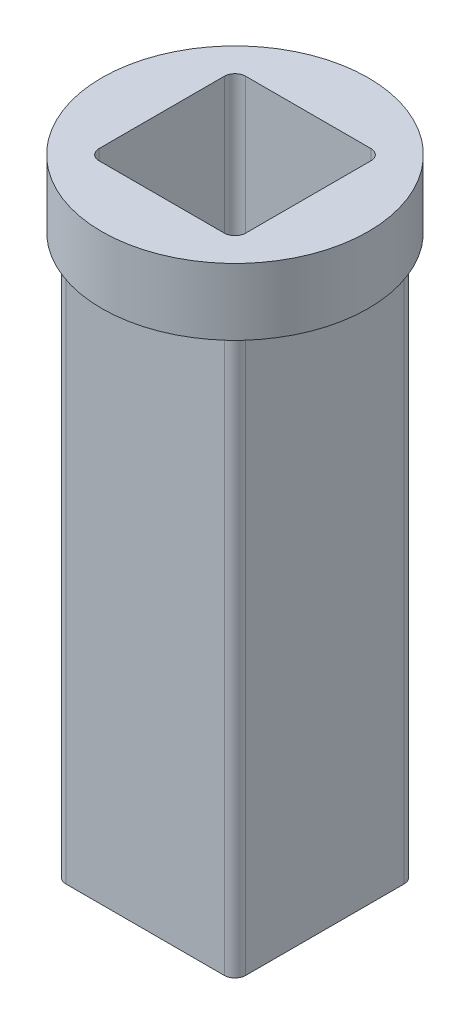
ISO-10303-21;
HEADER;
FILE_DESCRIPTION(('STEP AP214'),'2;1');
FILE_NAME('part.step','',(''),(''),'','','');
FILE_SCHEMA(('AUTOMOTIVE_DESIGN { 1 0 10303 214 1 1 1 1 }'));
ENDSEC;
DATA;
#1=APPLICATION_CONTEXT('core data for automotive mechanical design processes');
#2=APPLICATION_PROTOCOL_DEFINITION('international standard','automotive_design',2000,#1);
#3=PRODUCT_CONTEXT('',#1,'mechanical');
#4=PRODUCT('Part','Part','',(#3));
#5=PRODUCT_RELATED_PRODUCT_CATEGORY('part','',(#4));
#6=PRODUCT_DEFINITION_FORMATION('','',#4);
#7=PRODUCT_DEFINITION_CONTEXT('part definition',#1,'design');
#8=PRODUCT_DEFINITION('design','',#6,#7);
#9=PRODUCT_DEFINITION_SHAPE('','',#8);
#10=(LENGTH_UNIT() NAMED_UNIT(*) SI_UNIT(.MILLI.,.METRE.));
#11=(NAMED_UNIT(*) PLANE_ANGLE_UNIT() SI_UNIT($,.RADIAN.));
#12=(NAMED_UNIT(*) SI_UNIT($,.STERADIAN.) SOLID_ANGLE_UNIT());
#13=UNCERTAINTY_MEASURE_WITH_UNIT(LENGTH_MEASURE(1.E-05),#10,'distance_accuracy_value','');
#14=(GEOMETRIC_REPRESENTATION_CONTEXT(3) GLOBAL_UNCERTAINTY_ASSIGNED_CONTEXT((#13)) GLOBAL_UNIT_ASSIGNED_CONTEXT((#10,
#11,#12)) REPRESENTATION_CONTEXT('',''));
#15=CARTESIAN_POINT('',(0.,0.,0.));
#16=DIRECTION('',(0.,0.,1.));
#17=DIRECTION('',(1.,0.,0.));
#18=AXIS2_PLACEMENT_3D('',#15,#16,#17);
#19=CARTESIAN_POINT('',(-21.43125,133.35,-21.43125));
#20=DIRECTION('',(1.,0.,0.));
#21=DIRECTION('',(0.,0.,-1.));
#22=AXIS2_PLACEMENT_3D('',#19,#20,#21);
#23=PLANE('',#22);
#24=DIRECTION('',(0.,0.,1.));
#25=VECTOR('',#24,1.);
#26=CARTESIAN_POINT('',(-21.43125,0.,-21.43125));
#27=LINE('',#26,#25);
#28=CARTESIAN_POINT('',(-21.43125,0.,-18.89125));
#29=VERTEX_POINT('',#28);
#30=CARTESIAN_POINT('',(-21.43125,0.,18.89125));
#31=VERTEX_POINT('',#30);
#32=EDGE_CURVE('E202',#29,#31,#27,.T.);
#33=ORIENTED_EDGE('',*,*,#32,.T.);
#34=DIRECTION('',(0.,-1.,0.));
#35=VECTOR('',#34,1.);
#36=CARTESIAN_POINT('',(-21.43125,133.35,18.89125));
#37=LINE('',#36,#35);
#38=CARTESIAN_POINT('',(-21.43125,133.35,18.89125));
#39=VERTEX_POINT('',#38);
#40=EDGE_CURVE('E268',#31,#39,#37,.F.);
#41=ORIENTED_EDGE('',*,*,#40,.T.);
#42=DIRECTION('',(0.,0.,1.));
#43=VECTOR('',#42,1.);
#44=CARTESIAN_POINT('',(-21.43125,133.35,-21.43125));
#45=LINE('',#44,#43);
#46=CARTESIAN_POINT('',(-21.43125,133.35,-18.89125));
#47=VERTEX_POINT('',#46);
#48=EDGE_CURVE('E205',#47,#39,#45,.T.);
#49=ORIENTED_EDGE('',*,*,#48,.F.);
#50=DIRECTION('',(0.,-1.,0.));
#51=VECTOR('',#50,1.);
#52=CARTESIAN_POINT('',(-21.43125,133.35,-18.89125));
#53=LINE('',#52,#51);
#54=EDGE_CURVE('E265',#47,#29,#53,.T.);
#55=ORIENTED_EDGE('',*,*,#54,.T.);
#56=EDGE_LOOP('',(#33,#41,#49,#55));
#57=FACE_BOUND('',#56,.T.);
#58=ADVANCED_FACE('F39',(#57),#23,.F.);
#59=CARTESIAN_POINT('',(21.43125,133.35,21.43125));
#60=DIRECTION('',(0.,0.,-1.));
#61=DIRECTION('',(-1.,0.,0.));
#62=AXIS2_PLACEMENT_3D('',#59,#60,#61);
#63=PLANE('',#62);
#64=DIRECTION('',(1.,0.,0.));
#65=VECTOR('',#64,1.);
#66=CARTESIAN_POINT('',(21.43125,0.,21.43125));
#67=LINE('',#66,#65);
#68=CARTESIAN_POINT('',(-18.89125,0.,21.43125));
#69=VERTEX_POINT('',#68);
#70=CARTESIAN_POINT('',(18.89125,0.,21.43125));
#71=VERTEX_POINT('',#70);
#72=EDGE_CURVE('E218',#69,#71,#67,.T.);
#73=ORIENTED_EDGE('',*,*,#72,.T.);
#74=DIRECTION('',(0.,-1.,0.));
#75=VECTOR('',#74,1.);
#76=CARTESIAN_POINT('',(18.89125,133.35,21.43125));
#77=LINE('',#76,#75);
#78=CARTESIAN_POINT('',(18.89125,133.35,21.43125));
#79=VERTEX_POINT('',#78);
#80=EDGE_CURVE('E263',#71,#79,#77,.F.);
#81=ORIENTED_EDGE('',*,*,#80,.T.);
#82=DIRECTION('',(1.,0.,0.));
#83=VECTOR('',#82,1.);
#84=CARTESIAN_POINT('',(21.43125,133.35,21.43125));
#85=LINE('',#84,#83);
#86=CARTESIAN_POINT('',(-18.89125,133.35,21.43125));
#87=VERTEX_POINT('',#86);
#88=EDGE_CURVE('E208',#87,#79,#85,.T.);
#89=ORIENTED_EDGE('',*,*,#88,.F.);
#90=DIRECTION('',(0.,-1.,0.));
#91=VECTOR('',#90,1.);
#92=CARTESIAN_POINT('',(-18.89125,133.35,21.43125));
#93=LINE('',#92,#91);
#94=EDGE_CURVE('E260',#87,#69,#93,.T.);
#95=ORIENTED_EDGE('',*,*,#94,.T.);
#96=EDGE_LOOP('',(#73,#81,#89,#95));
#97=FACE_BOUND('',#96,.T.);
#98=ADVANCED_FACE('F289',(#97),#63,.F.);
#99=CARTESIAN_POINT('',(21.43125,133.35,-21.43125));
#100=DIRECTION('',(-1.,0.,0.));
#101=DIRECTION('',(0.,0.,1.));
#102=AXIS2_PLACEMENT_3D('',#99,#100,#101);
#103=PLANE('',#102);
#104=DIRECTION('',(0.,0.,-1.));
#105=VECTOR('',#104,1.);
#106=CARTESIAN_POINT('',(21.43125,133.35,-21.43125));
#107=LINE('',#106,#105);
#108=CARTESIAN_POINT('',(21.43125,133.35,18.89125));
#109=VERTEX_POINT('',#108);
#110=CARTESIAN_POINT('',(21.43125,133.35,-18.89125));
#111=VERTEX_POINT('',#110);
#112=EDGE_CURVE('E212',#109,#111,#107,.T.);
#113=ORIENTED_EDGE('',*,*,#112,.F.);
#114=DIRECTION('',(0.,-1.,0.));
#115=VECTOR('',#114,1.);
#116=CARTESIAN_POINT('',(21.43125,133.35,18.89125));
#117=LINE('',#116,#115);
#118=CARTESIAN_POINT('',(21.43125,0.,18.89125));
#119=VERTEX_POINT('',#118);
#120=EDGE_CURVE('E249',#109,#119,#117,.T.);
#121=ORIENTED_EDGE('',*,*,#120,.T.);
#122=DIRECTION('',(0.,0.,-1.));
#123=VECTOR('',#122,1.);
#124=CARTESIAN_POINT('',(21.43125,0.,-21.43125));
#125=LINE('',#124,#123);
#126=CARTESIAN_POINT('',(21.43125,0.,-18.89125));
#127=VERTEX_POINT('',#126);
#128=EDGE_CURVE('E221',#119,#127,#125,.T.);
#129=ORIENTED_EDGE('',*,*,#128,.T.);
#130=DIRECTION('',(0.,-1.,0.));
#131=VECTOR('',#130,1.);
#132=CARTESIAN_POINT('',(21.43125,133.35,-18.89125));
#133=LINE('',#132,#131);
#134=EDGE_CURVE('E247',#127,#111,#133,.F.);
#135=ORIENTED_EDGE('',*,*,#134,.T.);
#136=EDGE_LOOP('',(#113,#121,#129,#135));
#137=FACE_BOUND('',#136,.T.);
#138=ADVANCED_FACE('F309',(#137),#103,.F.);
#139=CARTESIAN_POINT('',(21.43125,133.35,-21.43125));
#140=DIRECTION('',(0.,0.,1.));
#141=DIRECTION('',(1.,0.,0.));
#142=AXIS2_PLACEMENT_3D('',#139,#140,#141);
#143=PLANE('',#142);
#144=DIRECTION('',(-1.,0.,0.));
#145=VECTOR('',#144,1.);
#146=CARTESIAN_POINT('',(21.43125,133.35,-21.43125));
#147=LINE('',#146,#145);
#148=CARTESIAN_POINT('',(18.89125,133.35,-21.43125));
#149=VERTEX_POINT('',#148);
#150=CARTESIAN_POINT('',(-18.89125,133.35,-21.43125));
#151=VERTEX_POINT('',#150);
#152=EDGE_CURVE('E214',#149,#151,#147,.T.);
#153=ORIENTED_EDGE('',*,*,#152,.F.);
#154=DIRECTION('',(0.,-1.,0.));
#155=VECTOR('',#154,1.);
#156=CARTESIAN_POINT('',(18.89125,133.35,-21.43125));
#157=LINE('',#156,#155);
#158=CARTESIAN_POINT('',(18.89125,0.,-21.43125));
#159=VERTEX_POINT('',#158);
#160=EDGE_CURVE('E163',#149,#159,#157,.T.);
#161=ORIENTED_EDGE('',*,*,#160,.T.);
#162=DIRECTION('',(-1.,0.,0.));
#163=VECTOR('',#162,1.);
#164=CARTESIAN_POINT('',(21.43125,0.,-21.43125));
#165=LINE('',#164,#163);
#166=CARTESIAN_POINT('',(-18.89125,0.,-21.43125));
#167=VERTEX_POINT('',#166);
#168=EDGE_CURVE('E209',#159,#167,#165,.T.);
#169=ORIENTED_EDGE('',*,*,#168,.T.);
#170=DIRECTION('',(0.,-1.,0.));
#171=VECTOR('',#170,1.);
#172=CARTESIAN_POINT('',(-18.89125,133.35,-21.43125));
#173=LINE('',#172,#171);
#174=EDGE_CURVE('E54',#167,#151,#173,.F.);
#175=ORIENTED_EDGE('',*,*,#174,.T.);
#176=EDGE_LOOP('',(#153,#161,#169,#175));
#177=FACE_BOUND('',#176,.T.);
#178=ADVANCED_FACE('F302',(#177),#143,.F.);
#179=CARTESIAN_POINT('',(0.,0.,0.));
#180=DIRECTION('',(0.,-1.,0.));
#181=DIRECTION('',(0.,0.,-1.));
#182=AXIS2_PLACEMENT_3D('',#179,#180,#181);
#183=PLANE('',#182);
#184=ORIENTED_EDGE('',*,*,#128,.F.);
#185=CARTESIAN_POINT('',(18.89125,0.,18.89125));
#186=DIRECTION('',(0.,-1.,0.));
#187=DIRECTION('',(0.,0.,-1.));
#188=AXIS2_PLACEMENT_3D('',#185,#186,#187);
#189=CIRCLE('',#188,2.54);
#190=EDGE_CURVE('E258',#119,#71,#189,.T.);
#191=ORIENTED_EDGE('',*,*,#190,.T.);
#192=ORIENTED_EDGE('',*,*,#72,.F.);
#193=CARTESIAN_POINT('',(-18.89125,0.,18.89125));
#194=DIRECTION('',(0.,-1.,0.));
#195=DIRECTION('',(0.,0.,-1.));
#196=AXIS2_PLACEMENT_3D('',#193,#194,#195);
#197=CIRCLE('',#196,2.54);
#198=EDGE_CURVE('E256',#69,#31,#197,.T.);
#199=ORIENTED_EDGE('',*,*,#198,.T.);
#200=ORIENTED_EDGE('',*,*,#32,.F.);
#201=CARTESIAN_POINT('',(-18.89125,0.,-18.89125));
#202=DIRECTION('',(0.,-1.,0.));
#203=DIRECTION('',(0.,0.,-1.));
#204=AXIS2_PLACEMENT_3D('',#201,#202,#203);
#205=CIRCLE('',#204,2.54);
#206=EDGE_CURVE('E252',#29,#167,#205,.T.);
#207=ORIENTED_EDGE('',*,*,#206,.T.);
#208=ORIENTED_EDGE('',*,*,#168,.F.);
#209=CARTESIAN_POINT('',(18.89125,0.,-18.89125));
#210=DIRECTION('',(0.,-1.,0.));
#211=DIRECTION('',(0.,0.,-1.));
#212=AXIS2_PLACEMENT_3D('',#209,#210,#211);
#213=CIRCLE('',#212,2.54);
#214=EDGE_CURVE('E254',#159,#127,#213,.T.);
#215=ORIENTED_EDGE('',*,*,#214,.T.);
#216=EDGE_LOOP('',(#184,#191,#192,#199,#200,#207,#208,#215));
#217=FACE_BOUND('',#216,.T.);
#218=ADVANCED_FACE('F296',(#217),#183,.T.);
#219=CARTESIAN_POINT('',(0.,133.35,0.));
#220=DIRECTION('',(0.,1.,0.));
#221=DIRECTION('',(0.,0.,1.));
#222=AXIS2_PLACEMENT_3D('',#219,#220,#221);
#223=PLANE('',#222);
#224=CARTESIAN_POINT('',(0.,133.35,0.));
#225=DIRECTION('',(0.,1.,0.));
#226=DIRECTION('',(0.,0.,1.));
#227=AXIS2_PLACEMENT_3D('',#224,#225,#226);
#228=CIRCLE('',#227,31.75);
#229=CARTESIAN_POINT('',(0.,133.35,31.75));
#230=VERTEX_POINT('',#229);
#231=EDGE_CURVE('E193',#230,#230,#228,.T.);
#232=ORIENTED_EDGE('',*,*,#231,.F.);
#233=EDGE_LOOP('',(#232));
#234=FACE_BOUND('',#233,.T.);
#235=ORIENTED_EDGE('',*,*,#112,.T.);
#236=CARTESIAN_POINT('',(18.89125,133.35,-18.89125));
#237=DIRECTION('',(0.,1.,0.));
#238=DIRECTION('',(0.,0.,1.));
#239=AXIS2_PLACEMENT_3D('',#236,#237,#238);
#240=CIRCLE('',#239,2.54);
#241=EDGE_CURVE('E47',#111,#149,#240,.T.);
#242=ORIENTED_EDGE('',*,*,#241,.T.);
#243=ORIENTED_EDGE('',*,*,#152,.T.);
#244=CARTESIAN_POINT('',(-18.89125,133.35,-18.89125));
#245=DIRECTION('',(0.,1.,0.));
#246=DIRECTION('',(0.,0.,1.));
#247=AXIS2_PLACEMENT_3D('',#244,#245,#246);
#248=CIRCLE('',#247,2.54);
#249=EDGE_CURVE('E12',#151,#47,#248,.T.);
#250=ORIENTED_EDGE('',*,*,#249,.T.);
#251=ORIENTED_EDGE('',*,*,#48,.T.);
#252=CARTESIAN_POINT('',(-18.89125,133.35,18.89125));
#253=DIRECTION('',(0.,1.,0.));
#254=DIRECTION('',(0.,0.,1.));
#255=AXIS2_PLACEMENT_3D('',#252,#253,#254);
#256=CIRCLE('',#255,2.54);
#257=EDGE_CURVE('E279',#39,#87,#256,.T.);
#258=ORIENTED_EDGE('',*,*,#257,.T.);
#259=ORIENTED_EDGE('',*,*,#88,.T.);
#260=CARTESIAN_POINT('',(18.89125,133.35,18.89125));
#261=DIRECTION('',(0.,1.,0.));
#262=DIRECTION('',(0.,0.,1.));
#263=AXIS2_PLACEMENT_3D('',#260,#261,#262);
#264=CIRCLE('',#263,2.54);
#265=EDGE_CURVE('E275',#79,#109,#264,.T.);
#266=ORIENTED_EDGE('',*,*,#265,.T.);
#267=EDGE_LOOP('',(#235,#242,#243,#250,#251,#258,#259,#266));
#268=FACE_BOUND('',#267,.T.);
#269=ADVANCED_FACE('F282',(#234,#268),#223,.F.);
#270=CARTESIAN_POINT('',(0.,149.225,0.));
#271=DIRECTION('',(0.,-1.,0.));
#272=DIRECTION('',(0.,0.,-1.));
#273=AXIS2_PLACEMENT_3D('',#270,#271,#272);
#274=CYLINDRICAL_SURFACE('',#273,31.75);
#275=CARTESIAN_POINT('',(0.,149.225,0.));
#276=DIRECTION('',(0.,1.,0.));
#277=DIRECTION('',(0.,0.,1.));
#278=AXIS2_PLACEMENT_3D('',#275,#276,#277);
#279=CIRCLE('',#278,31.75);
#280=CARTESIAN_POINT('',(0.,149.225,31.75));
#281=VERTEX_POINT('',#280);
#282=EDGE_CURVE('E199',#281,#281,#279,.T.);
#283=ORIENTED_EDGE('',*,*,#282,.F.);
#284=EDGE_LOOP('',(#283));
#285=FACE_BOUND('',#284,.T.);
#286=ORIENTED_EDGE('',*,*,#231,.T.);
#287=EDGE_LOOP('',(#286));
#288=FACE_BOUND('',#287,.T.);
#289=ADVANCED_FACE('F374',(#285,#288),#274,.T.);
#290=CARTESIAN_POINT('',(0.,149.225,0.));
#291=DIRECTION('',(0.,1.,0.));
#292=DIRECTION('',(0.,0.,1.));
#293=AXIS2_PLACEMENT_3D('',#290,#291,#292);
#294=PLANE('',#293);
#295=DIRECTION('',(1.,0.,0.));
#296=VECTOR('',#295,1.);
#297=CARTESIAN_POINT('',(17.4625,149.225,17.4625));
#298=LINE('',#297,#296);
#299=CARTESIAN_POINT('',(-14.9225,149.225,17.4625));
#300=VERTEX_POINT('',#299);
#301=CARTESIAN_POINT('',(14.9225,149.225,17.4625));
#302=VERTEX_POINT('',#301);
#303=EDGE_CURVE('E180',#300,#302,#298,.T.);
#304=ORIENTED_EDGE('',*,*,#303,.F.);
#305=CARTESIAN_POINT('',(-14.9225,149.225,14.9225));
#306=DIRECTION('',(0.,1.,0.));
#307=DIRECTION('',(0.,0.,1.));
#308=AXIS2_PLACEMENT_3D('',#305,#306,#307);
#309=CIRCLE('',#308,2.54);
#310=CARTESIAN_POINT('',(-17.4625,149.225,14.9225));
#311=VERTEX_POINT('',#310);
#312=EDGE_CURVE('E179',#300,#311,#309,.F.);
#313=ORIENTED_EDGE('',*,*,#312,.T.);
#314=DIRECTION('',(0.,0.,1.));
#315=VECTOR('',#314,1.);
#316=CARTESIAN_POINT('',(-17.4625,149.225,-17.4625));
#317=LINE('',#316,#315);
#318=CARTESIAN_POINT('',(-17.4625,149.225,-14.9225));
#319=VERTEX_POINT('',#318);
#320=EDGE_CURVE('E169',#319,#311,#317,.T.);
#321=ORIENTED_EDGE('',*,*,#320,.F.);
#322=CARTESIAN_POINT('',(-14.9225,149.225,-14.9225));
#323=DIRECTION('',(0.,1.,0.));
#324=DIRECTION('',(0.,0.,1.));
#325=AXIS2_PLACEMENT_3D('',#322,#323,#324);
#326=CIRCLE('',#325,2.54);
#327=CARTESIAN_POINT('',(-14.9225,149.225,-17.4625));
#328=VERTEX_POINT('',#327);
#329=EDGE_CURVE('E152',#319,#328,#326,.F.);
#330=ORIENTED_EDGE('',*,*,#329,.T.);
#331=DIRECTION('',(-1.,0.,0.));
#332=VECTOR('',#331,1.);
#333=CARTESIAN_POINT('',(17.4625,149.225,-17.4625));
#334=LINE('',#333,#332);
#335=CARTESIAN_POINT('',(14.9225,149.225,-17.4625));
#336=VERTEX_POINT('',#335);
#337=EDGE_CURVE('E191',#336,#328,#334,.T.);
#338=ORIENTED_EDGE('',*,*,#337,.F.);
#339=CARTESIAN_POINT('',(14.9225,149.225,-14.9225));
#340=DIRECTION('',(0.,1.,0.));
#341=DIRECTION('',(0.,0.,1.));
#342=AXIS2_PLACEMENT_3D('',#339,#340,#341);
#343=CIRCLE('',#342,2.54);
#344=CARTESIAN_POINT('',(17.4625,149.225,-14.9225));
#345=VERTEX_POINT('',#344);
#346=EDGE_CURVE('E162',#336,#345,#343,.F.);
#347=ORIENTED_EDGE('',*,*,#346,.T.);
#348=DIRECTION('',(0.,0.,-1.));
#349=VECTOR('',#348,1.);
#350=CARTESIAN_POINT('',(17.4625,149.225,-17.4625));
#351=LINE('',#350,#349);
#352=CARTESIAN_POINT('',(17.4625,149.225,14.9225));
#353=VERTEX_POINT('',#352);
#354=EDGE_CURVE('E183',#353,#345,#351,.T.);
#355=ORIENTED_EDGE('',*,*,#354,.F.);
#356=CARTESIAN_POINT('',(14.9225,149.225,14.9225));
#357=DIRECTION('',(0.,1.,0.));
#358=DIRECTION('',(0.,0.,1.));
#359=AXIS2_PLACEMENT_3D('',#356,#357,#358);
#360=CIRCLE('',#359,2.54);
#361=EDGE_CURVE('E277',#353,#302,#360,.F.);
#362=ORIENTED_EDGE('',*,*,#361,.T.);
#363=EDGE_LOOP('',(#304,#313,#321,#330,#338,#347,#355,#362));
#364=FACE_BOUND('',#363,.T.);
#365=ORIENTED_EDGE('',*,*,#282,.T.);
#366=EDGE_LOOP('',(#365));
#367=FACE_BOUND('',#366,.T.);
#368=ADVANCED_FACE('F177',(#364,#367),#294,.T.);
#369=CARTESIAN_POINT('',(0.,3.175,0.));
#370=DIRECTION('',(0.,-1.,0.));
#371=DIRECTION('',(0.,0.,-1.));
#372=AXIS2_PLACEMENT_3D('',#369,#370,#371);
#373=PLANE('',#372);
#374=DIRECTION('',(-1.,0.,0.));
#375=VECTOR('',#374,1.);
#376=CARTESIAN_POINT('',(17.4625,3.175,-17.4625));
#377=LINE('',#376,#375);
#378=CARTESIAN_POINT('',(14.9225,3.175,-17.4625));
#379=VERTEX_POINT('',#378);
#380=CARTESIAN_POINT('',(-14.9225,3.175,-17.4625));
#381=VERTEX_POINT('',#380);
#382=EDGE_CURVE('E194',#379,#381,#377,.T.);
#383=ORIENTED_EDGE('',*,*,#382,.T.);
#384=CARTESIAN_POINT('',(-14.9225,3.175,-14.9225));
#385=DIRECTION('',(0.,-1.,0.));
#386=DIRECTION('',(0.,0.,-1.));
#387=AXIS2_PLACEMENT_3D('',#384,#385,#386);
#388=CIRCLE('',#387,2.54);
#389=CARTESIAN_POINT('',(-17.4625,3.175,-14.9225));
#390=VERTEX_POINT('',#389);
#391=EDGE_CURVE('E235',#381,#390,#388,.F.);
#392=ORIENTED_EDGE('',*,*,#391,.T.);
#393=DIRECTION('',(0.,0.,1.));
#394=VECTOR('',#393,1.);
#395=CARTESIAN_POINT('',(-17.4625,3.175,-17.4625));
#396=LINE('',#395,#394);
#397=CARTESIAN_POINT('',(-17.4625,3.175,14.9225));
#398=VERTEX_POINT('',#397);
#399=EDGE_CURVE('E172',#390,#398,#396,.T.);
#400=ORIENTED_EDGE('',*,*,#399,.T.);
#401=CARTESIAN_POINT('',(-14.9225,3.175,14.9225));
#402=DIRECTION('',(0.,-1.,0.));
#403=DIRECTION('',(0.,0.,-1.));
#404=AXIS2_PLACEMENT_3D('',#401,#402,#403);
#405=CIRCLE('',#404,2.54);
#406=CARTESIAN_POINT('',(-14.9225,3.175,17.4625));
#407=VERTEX_POINT('',#406);
#408=EDGE_CURVE('E231',#398,#407,#405,.F.);
#409=ORIENTED_EDGE('',*,*,#408,.T.);
#410=DIRECTION('',(1.,0.,0.));
#411=VECTOR('',#410,1.);
#412=CARTESIAN_POINT('',(17.4625,3.175,17.4625));
#413=LINE('',#412,#411);
#414=CARTESIAN_POINT('',(14.9225,3.175,17.4625));
#415=VERTEX_POINT('',#414);
#416=EDGE_CURVE('E187',#407,#415,#413,.T.);
#417=ORIENTED_EDGE('',*,*,#416,.T.);
#418=CARTESIAN_POINT('',(14.9225,3.175,14.9225));
#419=DIRECTION('',(0.,-1.,0.));
#420=DIRECTION('',(0.,0.,-1.));
#421=AXIS2_PLACEMENT_3D('',#418,#419,#420);
#422=CIRCLE('',#421,2.54);
#423=CARTESIAN_POINT('',(17.4625,3.175,14.9225));
#424=VERTEX_POINT('',#423);
#425=EDGE_CURVE('E229',#415,#424,#422,.F.);
#426=ORIENTED_EDGE('',*,*,#425,.T.);
#427=DIRECTION('',(0.,0.,-1.));
#428=VECTOR('',#427,1.);
#429=CARTESIAN_POINT('',(17.4625,3.175,-17.4625));
#430=LINE('',#429,#428);
#431=CARTESIAN_POINT('',(17.4625,3.175,-14.9225));
#432=VERTEX_POINT('',#431);
#433=EDGE_CURVE('E190',#424,#432,#430,.T.);
#434=ORIENTED_EDGE('',*,*,#433,.T.);
#435=CARTESIAN_POINT('',(14.9225,3.175,-14.9225));
#436=DIRECTION('',(0.,-1.,0.));
#437=DIRECTION('',(0.,0.,-1.));
#438=AXIS2_PLACEMENT_3D('',#435,#436,#437);
#439=CIRCLE('',#438,2.54);
#440=EDGE_CURVE('E233',#432,#379,#439,.F.);
#441=ORIENTED_EDGE('',*,*,#440,.T.);
#442=EDGE_LOOP('',(#383,#392,#400,#409,#417,#426,#434,#441));
#443=FACE_BOUND('',#442,.T.);
#444=ADVANCED_FACE('F345',(#443),#373,.F.);
#445=CARTESIAN_POINT('',(17.4625,-49.3914086658803,17.4625));
#446=DIRECTION('',(0.,0.,1.));
#447=DIRECTION('',(1.,0.,0.));
#448=AXIS2_PLACEMENT_3D('',#445,#446,#447);
#449=PLANE('',#448);
#450=ORIENTED_EDGE('',*,*,#416,.F.);
#451=DIRECTION('',(0.,1.,0.));
#452=VECTOR('',#451,1.);
#453=CARTESIAN_POINT('',(-14.9225,149.225,17.4625));
#454=LINE('',#453,#452);
#455=EDGE_CURVE('E244',#407,#300,#454,.T.);
#456=ORIENTED_EDGE('',*,*,#455,.T.);
#457=ORIENTED_EDGE('',*,*,#303,.T.);
#458=DIRECTION('',(0.,1.,0.));
#459=VECTOR('',#458,1.);
#460=CARTESIAN_POINT('',(14.9225,3.175,17.4625));
#461=LINE('',#460,#459);
#462=EDGE_CURVE('E242',#302,#415,#461,.F.);
#463=ORIENTED_EDGE('',*,*,#462,.T.);
#464=EDGE_LOOP('',(#450,#456,#457,#463));
#465=FACE_BOUND('',#464,.T.);
#466=ADVANCED_FACE('F358',(#465),#449,.F.);
#467=CARTESIAN_POINT('',(17.4625,-49.3914086658803,-17.4625));
#468=DIRECTION('',(1.,0.,0.));
#469=DIRECTION('',(0.,0.,-1.));
#470=AXIS2_PLACEMENT_3D('',#467,#468,#469);
#471=PLANE('',#470);
#472=ORIENTED_EDGE('',*,*,#354,.T.);
#473=DIRECTION('',(0.,1.,0.));
#474=VECTOR('',#473,1.);
#475=CARTESIAN_POINT('',(17.4625,3.175,-14.9225));
#476=LINE('',#475,#474);
#477=EDGE_CURVE('E240',#345,#432,#476,.F.);
#478=ORIENTED_EDGE('',*,*,#477,.T.);
#479=ORIENTED_EDGE('',*,*,#433,.F.);
#480=DIRECTION('',(0.,1.,0.));
#481=VECTOR('',#480,1.);
#482=CARTESIAN_POINT('',(17.4625,149.225,14.9225));
#483=LINE('',#482,#481);
#484=EDGE_CURVE('E237',#424,#353,#483,.T.);
#485=ORIENTED_EDGE('',*,*,#484,.T.);
#486=EDGE_LOOP('',(#472,#478,#479,#485));
#487=FACE_BOUND('',#486,.T.);
#488=ADVANCED_FACE('F353',(#487),#471,.F.);
#489=CARTESIAN_POINT('',(17.4625,-49.3914086658803,-17.4625));
#490=DIRECTION('',(0.,0.,-1.));
#491=DIRECTION('',(-1.,0.,0.));
#492=AXIS2_PLACEMENT_3D('',#489,#490,#491);
#493=PLANE('',#492);
#494=ORIENTED_EDGE('',*,*,#337,.T.);
#495=DIRECTION('',(0.,1.,0.));
#496=VECTOR('',#495,1.);
#497=CARTESIAN_POINT('',(-14.9225,3.175,-17.4625));
#498=LINE('',#497,#496);
#499=EDGE_CURVE('E157',#328,#381,#498,.F.);
#500=ORIENTED_EDGE('',*,*,#499,.T.);
#501=ORIENTED_EDGE('',*,*,#382,.F.);
#502=DIRECTION('',(0.,1.,0.));
#503=VECTOR('',#502,1.);
#504=CARTESIAN_POINT('',(14.9225,149.225,-17.4625));
#505=LINE('',#504,#503);
#506=EDGE_CURVE('E173',#379,#336,#505,.T.);
#507=ORIENTED_EDGE('',*,*,#506,.T.);
#508=EDGE_LOOP('',(#494,#500,#501,#507));
#509=FACE_BOUND('',#508,.T.);
#510=ADVANCED_FACE('F348',(#509),#493,.F.);
#511=CARTESIAN_POINT('',(-17.4625,-49.3914086658803,-17.4625));
#512=DIRECTION('',(-1.,0.,0.));
#513=DIRECTION('',(0.,0.,1.));
#514=AXIS2_PLACEMENT_3D('',#511,#512,#513);
#515=PLANE('',#514);
#516=ORIENTED_EDGE('',*,*,#399,.F.);
#517=DIRECTION('',(0.,1.,0.));
#518=VECTOR('',#517,1.);
#519=CARTESIAN_POINT('',(-17.4625,149.225,-14.9225));
#520=LINE('',#519,#518);
#521=EDGE_CURVE('E156',#390,#319,#520,.T.);
#522=ORIENTED_EDGE('',*,*,#521,.T.);
#523=ORIENTED_EDGE('',*,*,#320,.T.);
#524=DIRECTION('',(0.,1.,0.));
#525=VECTOR('',#524,1.);
#526=CARTESIAN_POINT('',(-17.4625,3.175,14.9225));
#527=LINE('',#526,#525);
#528=EDGE_CURVE('E174',#311,#398,#527,.F.);
#529=ORIENTED_EDGE('',*,*,#528,.T.);
#530=EDGE_LOOP('',(#516,#522,#523,#529));
#531=FACE_BOUND('',#530,.T.);
#532=ADVANCED_FACE('F168',(#531),#515,.F.);
#533=CARTESIAN_POINT('',(-14.9225,-49.3914086658803,-14.9225));
#534=DIRECTION('',(0.,-1.,0.));
#535=DIRECTION('',(0.,0.,-1.));
#536=AXIS2_PLACEMENT_3D('',#533,#534,#535);
#537=CYLINDRICAL_SURFACE('',#536,2.54);
#538=ORIENTED_EDGE('',*,*,#391,.F.);
#539=ORIENTED_EDGE('',*,*,#499,.F.);
#540=ORIENTED_EDGE('',*,*,#329,.F.);
#541=ORIENTED_EDGE('',*,*,#521,.F.);
#542=EDGE_LOOP('',(#538,#539,#540,#541));
#543=FACE_BOUND('',#542,.T.);
#544=ADVANCED_FACE('F155',(#543),#537,.F.);
#545=CARTESIAN_POINT('',(14.9225,-49.3914086658803,-14.9225));
#546=DIRECTION('',(0.,-1.,0.));
#547=DIRECTION('',(0.,0.,-1.));
#548=AXIS2_PLACEMENT_3D('',#545,#546,#547);
#549=CYLINDRICAL_SURFACE('',#548,2.54);
#550=ORIENTED_EDGE('',*,*,#440,.F.);
#551=ORIENTED_EDGE('',*,*,#477,.F.);
#552=ORIENTED_EDGE('',*,*,#346,.F.);
#553=ORIENTED_EDGE('',*,*,#506,.F.);
#554=EDGE_LOOP('',(#550,#551,#552,#553));
#555=FACE_BOUND('',#554,.T.);
#556=ADVANCED_FACE('F323',(#555),#549,.F.);
#557=CARTESIAN_POINT('',(-14.9225,-49.3914086658803,14.9225));
#558=DIRECTION('',(0.,-1.,0.));
#559=DIRECTION('',(0.,0.,-1.));
#560=AXIS2_PLACEMENT_3D('',#557,#558,#559);
#561=CYLINDRICAL_SURFACE('',#560,2.54);
#562=ORIENTED_EDGE('',*,*,#408,.F.);
#563=ORIENTED_EDGE('',*,*,#528,.F.);
#564=ORIENTED_EDGE('',*,*,#312,.F.);
#565=ORIENTED_EDGE('',*,*,#455,.F.);
#566=EDGE_LOOP('',(#562,#563,#564,#565));
#567=FACE_BOUND('',#566,.T.);
#568=ADVANCED_FACE('F315',(#567),#561,.F.);
#569=CARTESIAN_POINT('',(18.89125,133.35,18.89125));
#570=DIRECTION('',(0.,-1.,0.));
#571=DIRECTION('',(0.,0.,-1.));
#572=AXIS2_PLACEMENT_3D('',#569,#570,#571);
#573=CYLINDRICAL_SURFACE('',#572,2.54);
#574=ORIENTED_EDGE('',*,*,#265,.F.);
#575=ORIENTED_EDGE('',*,*,#80,.F.);
#576=ORIENTED_EDGE('',*,*,#190,.F.);
#577=ORIENTED_EDGE('',*,*,#120,.F.);
#578=EDGE_LOOP('',(#574,#575,#576,#577));
#579=FACE_BOUND('',#578,.T.);
#580=ADVANCED_FACE('F312',(#579),#573,.T.);
#581=CARTESIAN_POINT('',(14.9225,-49.3914086658803,14.9225));
#582=DIRECTION('',(0.,-1.,0.));
#583=DIRECTION('',(0.,0.,-1.));
#584=AXIS2_PLACEMENT_3D('',#581,#582,#583);
#585=CYLINDRICAL_SURFACE('',#584,2.54);
#586=ORIENTED_EDGE('',*,*,#425,.F.);
#587=ORIENTED_EDGE('',*,*,#462,.F.);
#588=ORIENTED_EDGE('',*,*,#361,.F.);
#589=ORIENTED_EDGE('',*,*,#484,.F.);
#590=EDGE_LOOP('',(#586,#587,#588,#589));
#591=FACE_BOUND('',#590,.T.);
#592=ADVANCED_FACE('F314',(#591),#585,.F.);
#593=CARTESIAN_POINT('',(-18.89125,133.35,18.89125));
#594=DIRECTION('',(0.,-1.,0.));
#595=DIRECTION('',(0.,0.,-1.));
#596=AXIS2_PLACEMENT_3D('',#593,#594,#595);
#597=CYLINDRICAL_SURFACE('',#596,2.54);
#598=ORIENTED_EDGE('',*,*,#257,.F.);
#599=ORIENTED_EDGE('',*,*,#40,.F.);
#600=ORIENTED_EDGE('',*,*,#198,.F.);
#601=ORIENTED_EDGE('',*,*,#94,.F.);
#602=EDGE_LOOP('',(#598,#599,#600,#601));
#603=FACE_BOUND('',#602,.T.);
#604=ADVANCED_FACE('F292',(#603),#597,.T.);
#605=CARTESIAN_POINT('',(18.89125,133.35,-18.89125));
#606=DIRECTION('',(0.,-1.,0.));
#607=DIRECTION('',(0.,0.,-1.));
#608=AXIS2_PLACEMENT_3D('',#605,#606,#607);
#609=CYLINDRICAL_SURFACE('',#608,2.54);
#610=ORIENTED_EDGE('',*,*,#241,.F.);
#611=ORIENTED_EDGE('',*,*,#134,.F.);
#612=ORIENTED_EDGE('',*,*,#214,.F.);
#613=ORIENTED_EDGE('',*,*,#160,.F.);
#614=EDGE_LOOP('',(#610,#611,#612,#613));
#615=FACE_BOUND('',#614,.T.);
#616=ADVANCED_FACE('F305',(#615),#609,.T.);
#617=CARTESIAN_POINT('',(-18.89125,133.35,-18.89125));
#618=DIRECTION('',(0.,-1.,0.));
#619=DIRECTION('',(0.,0.,-1.));
#620=AXIS2_PLACEMENT_3D('',#617,#618,#619);
#621=CYLINDRICAL_SURFACE('',#620,2.54);
#622=ORIENTED_EDGE('',*,*,#249,.F.);
#623=ORIENTED_EDGE('',*,*,#174,.F.);
#624=ORIENTED_EDGE('',*,*,#206,.F.);
#625=ORIENTED_EDGE('',*,*,#54,.F.);
#626=EDGE_LOOP('',(#622,#623,#624,#625));
#627=FACE_BOUND('',#626,.T.);
#628=ADVANCED_FACE('F41',(#627),#621,.T.);
#629=CLOSED_SHELL('',(#58,#98,#138,#178,#218,#269,#289,#368,#444,#466,#488,#510,#532,#544,#556,
#568,#580,#592,#604,#616,#628));
#630=MANIFOLD_SOLID_BREP('B2',#629);
#631=ADVANCED_BREP_SHAPE_REPRESENTATION('',(#18,#630),#14);
#632=SHAPE_DEFINITION_REPRESENTATION(#9,#631);
ENDSEC;
END-ISO-10303-21;
